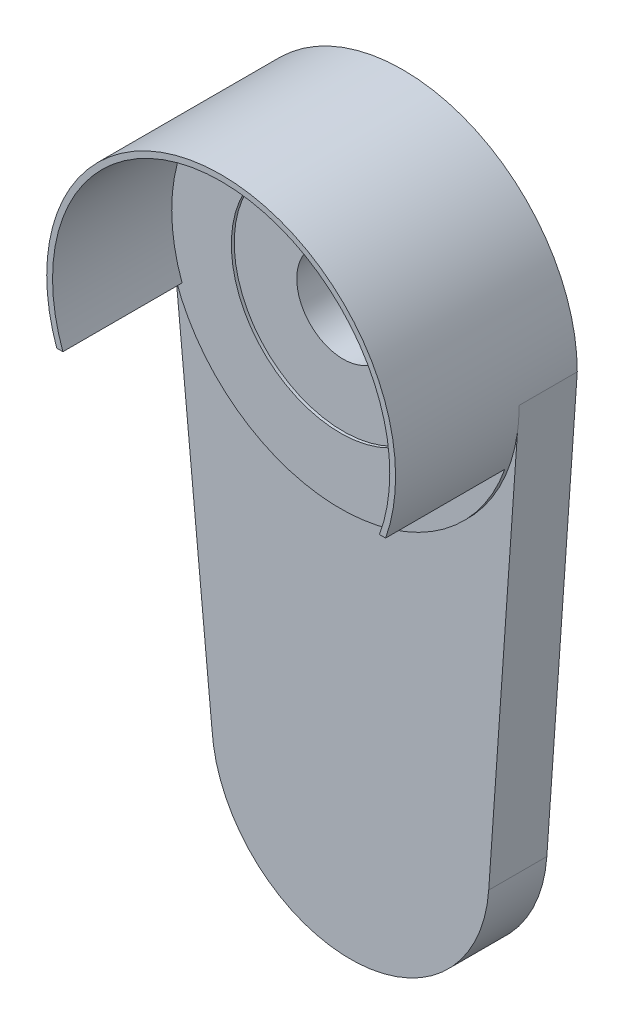
ISO-10303-21;
HEADER;
FILE_DESCRIPTION(('STEP AP214'),'2;1');
FILE_NAME('part.step','',(''),(''),'','','');
FILE_SCHEMA(('AUTOMOTIVE_DESIGN { 1 0 10303 214 1 1 1 1 }'));
ENDSEC;
DATA;
#1=APPLICATION_CONTEXT('core data for automotive mechanical design processes');
#2=APPLICATION_PROTOCOL_DEFINITION('international standard','automotive_design',2000,#1);
#3=PRODUCT_CONTEXT('',#1,'mechanical');
#4=PRODUCT('Part','Part','',(#3));
#5=PRODUCT_RELATED_PRODUCT_CATEGORY('part','',(#4));
#6=PRODUCT_DEFINITION_FORMATION('','',#4);
#7=PRODUCT_DEFINITION_CONTEXT('part definition',#1,'design');
#8=PRODUCT_DEFINITION('design','',#6,#7);
#9=PRODUCT_DEFINITION_SHAPE('','',#8);
#10=(LENGTH_UNIT() NAMED_UNIT(*) SI_UNIT(.MILLI.,.METRE.));
#11=(NAMED_UNIT(*) PLANE_ANGLE_UNIT() SI_UNIT($,.RADIAN.));
#12=(NAMED_UNIT(*) SI_UNIT($,.STERADIAN.) SOLID_ANGLE_UNIT());
#13=UNCERTAINTY_MEASURE_WITH_UNIT(LENGTH_MEASURE(1.E-05),#10,'distance_accuracy_value','');
#14=(GEOMETRIC_REPRESENTATION_CONTEXT(3) GLOBAL_UNCERTAINTY_ASSIGNED_CONTEXT((#13)) GLOBAL_UNIT_ASSIGNED_CONTEXT((#10,
#11,#12)) REPRESENTATION_CONTEXT('',''));
#15=CARTESIAN_POINT('',(0.,0.,0.));
#16=DIRECTION('',(0.,0.,1.));
#17=DIRECTION('',(1.,0.,0.));
#18=AXIS2_PLACEMENT_3D('',#15,#16,#17);
#19=CARTESIAN_POINT('',(0.,0.,0.));
#20=DIRECTION('',(0.,0.,1.));
#21=DIRECTION('',(1.,0.,0.));
#22=AXIS2_PLACEMENT_3D('',#19,#20,#21);
#23=PLANE('',#22);
#24=DIRECTION('',(-0.0697887398607694,-0.997561793468778,0.));
#25=VECTOR('',#24,1.);
#26=CARTESIAN_POINT('',(119.415543814638,-8.35422965993222,0.));
#27=LINE('',#26,#25);
#28=CARTESIAN_POINT('',(120.,0.,0.));
#29=VERTEX_POINT('',#28);
#30=CARTESIAN_POINT('',(118.831087629275,-16.7084593198645,0.));
#31=VERTEX_POINT('',#30);
#32=EDGE_CURVE('E132',#29,#31,#27,.T.);
#33=ORIENTED_EDGE('',*,*,#32,.F.);
#34=CARTESIAN_POINT('',(0.,0.,0.));
#35=DIRECTION('',(0.,0.,1.));
#36=DIRECTION('',(1.,0.,0.));
#37=AXIS2_PLACEMENT_3D('',#34,#35,#36);
#38=CIRCLE('',#37,120.);
#39=EDGE_CURVE('E178',#31,#29,#38,.T.);
#40=ORIENTED_EDGE('',*,*,#39,.F.);
#41=EDGE_LOOP('',(#33,#40));
#42=FACE_BOUND('',#41,.T.);
#43=ADVANCED_FACE('F35',(#42),#23,.F.);
#44=CARTESIAN_POINT('',(0.,0.,85.));
#45=DIRECTION('',(0.,0.,-1.));
#46=DIRECTION('',(-1.,0.,0.));
#47=AXIS2_PLACEMENT_3D('',#44,#45,#46);
#48=CYLINDRICAL_SURFACE('',#47,120.);
#49=ORIENTED_EDGE('',*,*,#39,.T.);
#50=DIRECTION('',(0.,0.,1.));
#51=VECTOR('',#50,1.);
#52=CARTESIAN_POINT('',(120.,0.,-40.));
#53=LINE('',#52,#51);
#54=CARTESIAN_POINT('',(120.,0.,-40.));
#55=VERTEX_POINT('',#54);
#56=EDGE_CURVE('E113',#55,#29,#53,.T.);
#57=ORIENTED_EDGE('',*,*,#56,.F.);
#58=CARTESIAN_POINT('',(0.,0.,-40.));
#59=DIRECTION('',(0.,0.,-1.));
#60=DIRECTION('',(-1.,0.,0.));
#61=AXIS2_PLACEMENT_3D('',#58,#59,#60);
#62=CIRCLE('',#61,120.);
#63=CARTESIAN_POINT('',(-120.,1.07552855510562E-13,-40.));
#64=VERTEX_POINT('',#63);
#65=EDGE_CURVE('E116',#64,#55,#62,.T.);
#66=ORIENTED_EDGE('',*,*,#65,.F.);
#67=DIRECTION('',(0.,0.,1.));
#68=VECTOR('',#67,1.);
#69=CARTESIAN_POINT('',(-120.,1.07552855510562E-13,-40.));
#70=LINE('',#69,#68);
#71=CARTESIAN_POINT('',(-120.,1.07552855510562E-13,0.));
#72=VERTEX_POINT('',#71);
#73=EDGE_CURVE('E104',#64,#72,#70,.T.);
#74=ORIENTED_EDGE('',*,*,#73,.T.);
#75=CARTESIAN_POINT('',(-117.805011812381,-22.8468639398211,0.));
#76=VERTEX_POINT('',#75);
#77=EDGE_CURVE('E44',#72,#76,#38,.T.);
#78=ORIENTED_EDGE('',*,*,#77,.T.);
#79=EDGE_CURVE('E185',#76,#31,#38,.T.);
#80=ORIENTED_EDGE('',*,*,#79,.T.);
#81=EDGE_LOOP('',(#49,#57,#66,#74,#78,#80));
#82=FACE_BOUND('',#81,.T.);
#83=DIRECTION('',(0.,0.,1.));
#84=VECTOR('',#83,1.);
#85=CARTESIAN_POINT('',(113.137084989848,-40.,3.));
#86=LINE('',#85,#84);
#87=CARTESIAN_POINT('',(113.137084989848,-40.,3.));
#88=VERTEX_POINT('',#87);
#89=CARTESIAN_POINT('',(113.137084989848,-40.,85.));
#90=VERTEX_POINT('',#89);
#91=EDGE_CURVE('E176',#88,#90,#86,.T.);
#92=ORIENTED_EDGE('',*,*,#91,.F.);
#93=CARTESIAN_POINT('',(0.,0.,3.));
#94=DIRECTION('',(0.,0.,1.));
#95=DIRECTION('',(1.,0.,0.));
#96=AXIS2_PLACEMENT_3D('',#93,#94,#95);
#97=CIRCLE('',#96,120.);
#98=CARTESIAN_POINT('',(-113.137084989848,-40.,3.));
#99=VERTEX_POINT('',#98);
#100=EDGE_CURVE('E164',#99,#88,#97,.T.);
#101=ORIENTED_EDGE('',*,*,#100,.F.);
#102=DIRECTION('',(0.,0.,1.));
#103=VECTOR('',#102,1.);
#104=CARTESIAN_POINT('',(-113.137084989848,-40.,3.));
#105=LINE('',#104,#103);
#106=CARTESIAN_POINT('',(-113.137084989848,-40.,85.));
#107=VERTEX_POINT('',#106);
#108=EDGE_CURVE('E179',#99,#107,#105,.T.);
#109=ORIENTED_EDGE('',*,*,#108,.T.);
#110=CARTESIAN_POINT('',(0.,0.,85.));
#111=DIRECTION('',(0.,0.,1.));
#112=DIRECTION('',(1.,0.,0.));
#113=AXIS2_PLACEMENT_3D('',#110,#111,#112);
#114=CIRCLE('',#113,120.);
#115=EDGE_CURVE('E11',#90,#107,#114,.T.);
#116=ORIENTED_EDGE('',*,*,#115,.F.);
#117=EDGE_LOOP('',(#92,#101,#109,#116));
#118=FACE_BOUND('',#117,.T.);
#119=ADVANCED_FACE('F37',(#82,#118),#48,.T.);
#120=CARTESIAN_POINT('',(0.,0.,85.));
#121=DIRECTION('',(0.,0.,1.));
#122=DIRECTION('',(1.,0.,0.));
#123=AXIS2_PLACEMENT_3D('',#120,#121,#122);
#124=PLANE('',#123);
#125=CARTESIAN_POINT('',(0.,0.,85.));
#126=DIRECTION('',(0.,0.,1.));
#127=DIRECTION('',(1.,0.,0.));
#128=AXIS2_PLACEMENT_3D('',#125,#126,#127);
#129=CIRCLE('',#128,116.);
#130=CARTESIAN_POINT('',(108.88526071053,-40.,85.));
#131=VERTEX_POINT('',#130);
#132=CARTESIAN_POINT('',(-108.88526071053,-40.,85.));
#133=VERTEX_POINT('',#132);
#134=EDGE_CURVE('E171',#131,#133,#129,.T.);
#135=ORIENTED_EDGE('',*,*,#134,.F.);
#136=DIRECTION('',(1.,0.,0.));
#137=VECTOR('',#136,1.);
#138=CARTESIAN_POINT('',(0.,-40.,85.));
#139=LINE('',#138,#137);
#140=EDGE_CURVE('E168',#131,#90,#139,.T.);
#141=ORIENTED_EDGE('',*,*,#140,.T.);
#142=ORIENTED_EDGE('',*,*,#115,.T.);
#143=DIRECTION('',(1.,0.,0.));
#144=VECTOR('',#143,1.);
#145=CARTESIAN_POINT('',(0.,-40.,85.));
#146=LINE('',#145,#144);
#147=EDGE_CURVE('E159',#107,#133,#146,.T.);
#148=ORIENTED_EDGE('',*,*,#147,.T.);
#149=EDGE_LOOP('',(#135,#141,#142,#148));
#150=FACE_BOUND('',#149,.T.);
#151=ADVANCED_FACE('F203',(#150),#124,.T.);
#152=ORIENTED_EDGE('',*,*,#77,.F.);
#153=DIRECTION('',(0.0956335930260791,-0.995416604183857,0.));
#154=VECTOR('',#153,1.);
#155=CARTESIAN_POINT('',(-118.902505906191,-11.4234319699105,0.));
#156=LINE('',#155,#154);
#157=EDGE_CURVE('E51',#72,#76,#156,.T.);
#158=ORIENTED_EDGE('',*,*,#157,.T.);
#159=EDGE_LOOP('',(#152,#158));
#160=FACE_BOUND('',#159,.T.);
#161=ADVANCED_FACE('F199',(#160),#23,.F.);
#162=CARTESIAN_POINT('',(0.,-40.,3.));
#163=DIRECTION('',(0.,-1.,0.));
#164=DIRECTION('',(0.,0.,-1.));
#165=AXIS2_PLACEMENT_3D('',#162,#163,#164);
#166=PLANE('',#165);
#167=ORIENTED_EDGE('',*,*,#140,.F.);
#168=DIRECTION('',(0.,0.,1.));
#169=VECTOR('',#168,1.);
#170=CARTESIAN_POINT('',(108.88526071053,-40.,3.));
#171=LINE('',#170,#169);
#172=CARTESIAN_POINT('',(108.88526071053,-40.,3.));
#173=VERTEX_POINT('',#172);
#174=EDGE_CURVE('E167',#173,#131,#171,.T.);
#175=ORIENTED_EDGE('',*,*,#174,.F.);
#176=DIRECTION('',(1.,0.,0.));
#177=VECTOR('',#176,1.);
#178=CARTESIAN_POINT('',(0.,-40.,3.));
#179=LINE('',#178,#177);
#180=EDGE_CURVE('E156',#173,#88,#179,.T.);
#181=ORIENTED_EDGE('',*,*,#180,.T.);
#182=ORIENTED_EDGE('',*,*,#91,.T.);
#183=EDGE_LOOP('',(#167,#175,#181,#182));
#184=FACE_BOUND('',#183,.T.);
#185=ADVANCED_FACE('F206',(#184),#166,.T.);
#186=CARTESIAN_POINT('',(0.,-40.,3.));
#187=DIRECTION('',(0.,-1.,0.));
#188=DIRECTION('',(0.,0.,-1.));
#189=AXIS2_PLACEMENT_3D('',#186,#187,#188);
#190=PLANE('',#189);
#191=ORIENTED_EDGE('',*,*,#147,.F.);
#192=ORIENTED_EDGE('',*,*,#108,.F.);
#193=DIRECTION('',(1.,0.,0.));
#194=VECTOR('',#193,1.);
#195=CARTESIAN_POINT('',(0.,-40.,3.));
#196=LINE('',#195,#194);
#197=CARTESIAN_POINT('',(-108.88526071053,-40.,3.));
#198=VERTEX_POINT('',#197);
#199=EDGE_CURVE('E162',#99,#198,#196,.T.);
#200=ORIENTED_EDGE('',*,*,#199,.T.);
#201=DIRECTION('',(0.,0.,1.));
#202=VECTOR('',#201,1.);
#203=CARTESIAN_POINT('',(-108.88526071053,-40.,3.));
#204=LINE('',#203,#202);
#205=EDGE_CURVE('E182',#198,#133,#204,.T.);
#206=ORIENTED_EDGE('',*,*,#205,.T.);
#207=EDGE_LOOP('',(#191,#192,#200,#206));
#208=FACE_BOUND('',#207,.T.);
#209=ADVANCED_FACE('F211',(#208),#190,.T.);
#210=CARTESIAN_POINT('',(0.,0.,3.));
#211=DIRECTION('',(0.,0.,1.));
#212=DIRECTION('',(1.,0.,0.));
#213=AXIS2_PLACEMENT_3D('',#210,#211,#212);
#214=CYLINDRICAL_SURFACE('',#213,116.);
#215=ORIENTED_EDGE('',*,*,#134,.T.);
#216=ORIENTED_EDGE('',*,*,#205,.F.);
#217=CARTESIAN_POINT('',(0.,0.,3.));
#218=DIRECTION('',(0.,0.,1.));
#219=DIRECTION('',(1.,0.,0.));
#220=AXIS2_PLACEMENT_3D('',#217,#218,#219);
#221=CIRCLE('',#220,116.);
#222=EDGE_CURVE('E158',#173,#198,#221,.T.);
#223=ORIENTED_EDGE('',*,*,#222,.F.);
#224=ORIENTED_EDGE('',*,*,#174,.T.);
#225=EDGE_LOOP('',(#215,#216,#223,#224));
#226=FACE_BOUND('',#225,.T.);
#227=ADVANCED_FACE('F219',(#226),#214,.F.);
#228=CARTESIAN_POINT('',(0.,0.,3.));
#229=DIRECTION('',(0.,0.,1.));
#230=DIRECTION('',(1.,0.,0.));
#231=AXIS2_PLACEMENT_3D('',#228,#229,#230);
#232=PLANE('',#231);
#233=CARTESIAN_POINT('',(0.,0.,3.));
#234=DIRECTION('',(0.,0.,1.));
#235=DIRECTION('',(1.,0.,0.));
#236=AXIS2_PLACEMENT_3D('',#233,#234,#235);
#237=CIRCLE('',#236,75.);
#238=CARTESIAN_POINT('',(75.,0.,3.));
#239=VERTEX_POINT('',#238);
#240=EDGE_CURVE('E39',#239,#239,#237,.T.);
#241=ORIENTED_EDGE('',*,*,#240,.F.);
#242=EDGE_LOOP('',(#241));
#243=FACE_BOUND('',#242,.T.);
#244=ORIENTED_EDGE('',*,*,#180,.F.);
#245=ORIENTED_EDGE('',*,*,#222,.T.);
#246=ORIENTED_EDGE('',*,*,#199,.F.);
#247=ORIENTED_EDGE('',*,*,#100,.T.);
#248=EDGE_LOOP('',(#244,#245,#246,#247));
#249=FACE_BOUND('',#248,.T.);
#250=ADVANCED_FACE('F222',(#243,#249),#232,.T.);
#251=CARTESIAN_POINT('',(0.,0.,1.));
#252=DIRECTION('',(0.,0.,1.));
#253=DIRECTION('',(1.,0.,0.));
#254=AXIS2_PLACEMENT_3D('',#251,#252,#253);
#255=CYLINDRICAL_SURFACE('',#254,75.);
#256=ORIENTED_EDGE('',*,*,#240,.T.);
#257=EDGE_LOOP('',(#256));
#258=FACE_BOUND('',#257,.T.);
#259=CARTESIAN_POINT('',(0.,0.,1.));
#260=DIRECTION('',(0.,0.,1.));
#261=DIRECTION('',(1.,0.,0.));
#262=AXIS2_PLACEMENT_3D('',#259,#260,#261);
#263=CIRCLE('',#262,75.);
#264=CARTESIAN_POINT('',(75.,0.,1.));
#265=VERTEX_POINT('',#264);
#266=EDGE_CURVE('E153',#265,#265,#263,.T.);
#267=ORIENTED_EDGE('',*,*,#266,.F.);
#268=EDGE_LOOP('',(#267));
#269=FACE_BOUND('',#268,.T.);
#270=ADVANCED_FACE('F229',(#258,#269),#255,.F.);
#271=CARTESIAN_POINT('',(0.,0.,1.));
#272=DIRECTION('',(0.,0.,1.));
#273=DIRECTION('',(1.,0.,0.));
#274=AXIS2_PLACEMENT_3D('',#271,#272,#273);
#275=PLANE('',#274);
#276=CARTESIAN_POINT('',(0.,0.,1.));
#277=DIRECTION('',(0.,0.,1.));
#278=DIRECTION('',(1.,0.,0.));
#279=AXIS2_PLACEMENT_3D('',#276,#277,#278);
#280=CIRCLE('',#279,32.);
#281=CARTESIAN_POINT('',(32.,0.,1.));
#282=VERTEX_POINT('',#281);
#283=EDGE_CURVE('E112',#282,#282,#280,.T.);
#284=ORIENTED_EDGE('',*,*,#283,.F.);
#285=EDGE_LOOP('',(#284));
#286=FACE_BOUND('',#285,.T.);
#287=ORIENTED_EDGE('',*,*,#266,.T.);
#288=EDGE_LOOP('',(#287));
#289=FACE_BOUND('',#288,.T.);
#290=ADVANCED_FACE('F233',(#286,#289),#275,.T.);
#291=CARTESIAN_POINT('',(0.,0.,-4.));
#292=DIRECTION('',(0.,0.,1.));
#293=DIRECTION('',(1.,0.,0.));
#294=AXIS2_PLACEMENT_3D('',#291,#292,#293);
#295=CYLINDRICAL_SURFACE('',#294,32.);
#296=ORIENTED_EDGE('',*,*,#283,.T.);
#297=EDGE_LOOP('',(#296));
#298=FACE_BOUND('',#297,.T.);
#299=CARTESIAN_POINT('',(0.,0.,-40.));
#300=DIRECTION('',(0.,0.,-1.));
#301=DIRECTION('',(-1.,0.,0.));
#302=AXIS2_PLACEMENT_3D('',#299,#300,#301);
#303=CIRCLE('',#302,32.);
#304=CARTESIAN_POINT('',(-32.,0.,-40.));
#305=VERTEX_POINT('',#304);
#306=EDGE_CURVE('E137',#305,#305,#303,.F.);
#307=ORIENTED_EDGE('',*,*,#306,.F.);
#308=EDGE_LOOP('',(#307));
#309=FACE_BOUND('',#308,.T.);
#310=ADVANCED_FACE('F237',(#298,#309),#295,.F.);
#311=CARTESIAN_POINT('',(-118.902505906191,-11.4234319699105,-40.));
#312=DIRECTION('',(-0.995416604183857,-0.0956335930260791,0.));
#313=DIRECTION('',(0.0956335930260791,-0.995416604183857,0.));
#314=AXIS2_PLACEMENT_3D('',#311,#312,#313);
#315=PLANE('',#314);
#316=ORIENTED_EDGE('',*,*,#157,.F.);
#317=ORIENTED_EDGE('',*,*,#73,.F.);
#318=DIRECTION('',(0.0956335930260791,-0.995416604183857,0.));
#319=VECTOR('',#318,1.);
#320=CARTESIAN_POINT('',(-118.902505906191,-11.4234319699105,-40.));
#321=LINE('',#320,#319);
#322=CARTESIAN_POINT('',(-91.3099220921763,-298.624981255157,-40.));
#323=VERTEX_POINT('',#322);
#324=EDGE_CURVE('E109',#64,#323,#321,.T.);
#325=ORIENTED_EDGE('',*,*,#324,.T.);
#326=DIRECTION('',(0.,0.,1.));
#327=VECTOR('',#326,1.);
#328=CARTESIAN_POINT('',(-91.3099220921763,-298.624981255157,-40.));
#329=LINE('',#328,#327);
#330=CARTESIAN_POINT('',(-91.3099220921763,-298.624981255157,0.));
#331=VERTEX_POINT('',#330);
#332=EDGE_CURVE('E140',#323,#331,#329,.T.);
#333=ORIENTED_EDGE('',*,*,#332,.T.);
#334=EDGE_CURVE('E143',#76,#331,#156,.T.);
#335=ORIENTED_EDGE('',*,*,#334,.F.);
#336=EDGE_LOOP('',(#316,#317,#325,#333,#335));
#337=FACE_BOUND('',#336,.T.);
#338=ADVANCED_FACE('F106',(#337),#315,.T.);
#339=CARTESIAN_POINT('',(119.415543814638,-8.35422965993222,-40.));
#340=DIRECTION('',(-0.997561793468778,0.0697887398607694,0.));
#341=DIRECTION('',(-0.0697887398607694,-0.997561793468778,0.));
#342=AXIS2_PLACEMENT_3D('',#339,#340,#341);
#343=PLANE('',#342);
#344=ORIENTED_EDGE('',*,*,#32,.T.);
#345=CARTESIAN_POINT('',(99.0633780417692,-299.268538040634,0.));
#346=VERTEX_POINT('',#345);
#347=EDGE_CURVE('E142',#31,#346,#27,.T.);
#348=ORIENTED_EDGE('',*,*,#347,.T.);
#349=DIRECTION('',(0.,0.,1.));
#350=VECTOR('',#349,1.);
#351=CARTESIAN_POINT('',(99.0633780417692,-299.268538040634,-40.));
#352=LINE('',#351,#350);
#353=CARTESIAN_POINT('',(99.0633780417692,-299.268538040634,-40.));
#354=VERTEX_POINT('',#353);
#355=EDGE_CURVE('E147',#354,#346,#352,.T.);
#356=ORIENTED_EDGE('',*,*,#355,.F.);
#357=DIRECTION('',(-0.0697887398607694,-0.997561793468778,0.));
#358=VECTOR('',#357,1.);
#359=CARTESIAN_POINT('',(119.415543814638,-8.35422965993222,-40.));
#360=LINE('',#359,#358);
#361=EDGE_CURVE('E122',#55,#354,#360,.T.);
#362=ORIENTED_EDGE('',*,*,#361,.F.);
#363=ORIENTED_EDGE('',*,*,#56,.T.);
#364=EDGE_LOOP('',(#344,#348,#356,#362,#363));
#365=FACE_BOUND('',#364,.T.);
#366=ADVANCED_FACE('F196',(#365),#343,.F.);
#367=CARTESIAN_POINT('',(3.8981465337455,-292.610843621114,-40.));
#368=DIRECTION('',(0.,0.,1.));
#369=DIRECTION('',(1.,0.,0.));
#370=AXIS2_PLACEMENT_3D('',#367,#368,#369);
#371=CYLINDRICAL_SURFACE('',#370,95.397831122932);
#372=CARTESIAN_POINT('',(3.8981465337455,-292.610843621114,0.));
#373=DIRECTION('',(0.,0.,-1.));
#374=DIRECTION('',(-1.,0.,0.));
#375=AXIS2_PLACEMENT_3D('',#372,#373,#374);
#376=CIRCLE('',#375,95.397831122932);
#377=EDGE_CURVE('E129',#346,#331,#376,.T.);
#378=ORIENTED_EDGE('',*,*,#377,.T.);
#379=ORIENTED_EDGE('',*,*,#332,.F.);
#380=CARTESIAN_POINT('',(3.8981465337455,-292.610843621114,-40.));
#381=DIRECTION('',(0.,0.,-1.));
#382=DIRECTION('',(-1.,0.,0.));
#383=AXIS2_PLACEMENT_3D('',#380,#381,#382);
#384=CIRCLE('',#383,95.397831122932);
#385=EDGE_CURVE('E127',#354,#323,#384,.T.);
#386=ORIENTED_EDGE('',*,*,#385,.F.);
#387=ORIENTED_EDGE('',*,*,#355,.T.);
#388=EDGE_LOOP('',(#378,#379,#386,#387));
#389=FACE_BOUND('',#388,.T.);
#390=ADVANCED_FACE('F193',(#389),#371,.T.);
#391=CARTESIAN_POINT('',(0.,0.,-40.));
#392=DIRECTION('',(0.,0.,-1.));
#393=DIRECTION('',(-1.,0.,0.));
#394=AXIS2_PLACEMENT_3D('',#391,#392,#393);
#395=PLANE('',#394);
#396=ORIENTED_EDGE('',*,*,#324,.F.);
#397=ORIENTED_EDGE('',*,*,#65,.T.);
#398=ORIENTED_EDGE('',*,*,#361,.T.);
#399=ORIENTED_EDGE('',*,*,#385,.T.);
#400=EDGE_LOOP('',(#396,#397,#398,#399));
#401=FACE_BOUND('',#400,.T.);
#402=ORIENTED_EDGE('',*,*,#306,.T.);
#403=EDGE_LOOP('',(#402));
#404=FACE_BOUND('',#403,.T.);
#405=ADVANCED_FACE('F124',(#401,#404),#395,.T.);
#406=CARTESIAN_POINT('',(0.,0.,0.));
#407=DIRECTION('',(0.,0.,-1.));
#408=DIRECTION('',(-1.,0.,0.));
#409=AXIS2_PLACEMENT_3D('',#406,#407,#408);
#410=PLANE('',#409);
#411=ORIENTED_EDGE('',*,*,#79,.F.);
#412=ORIENTED_EDGE('',*,*,#334,.T.);
#413=ORIENTED_EDGE('',*,*,#377,.F.);
#414=ORIENTED_EDGE('',*,*,#347,.F.);
#415=EDGE_LOOP('',(#411,#412,#413,#414));
#416=FACE_BOUND('',#415,.T.);
#417=ADVANCED_FACE('F190',(#416),#410,.F.);
#418=CLOSED_SHELL('',(#43,#119,#151,#161,#185,#209,#227,#250,#270,#290,#310,#338,#366,#390,#405,#417));
#419=MANIFOLD_SOLID_BREP('B2',#418);
#420=ADVANCED_BREP_SHAPE_REPRESENTATION('',(#18,#419),#14);
#421=SHAPE_DEFINITION_REPRESENTATION(#9,#420);
ENDSEC;
END-ISO-10303-21;
